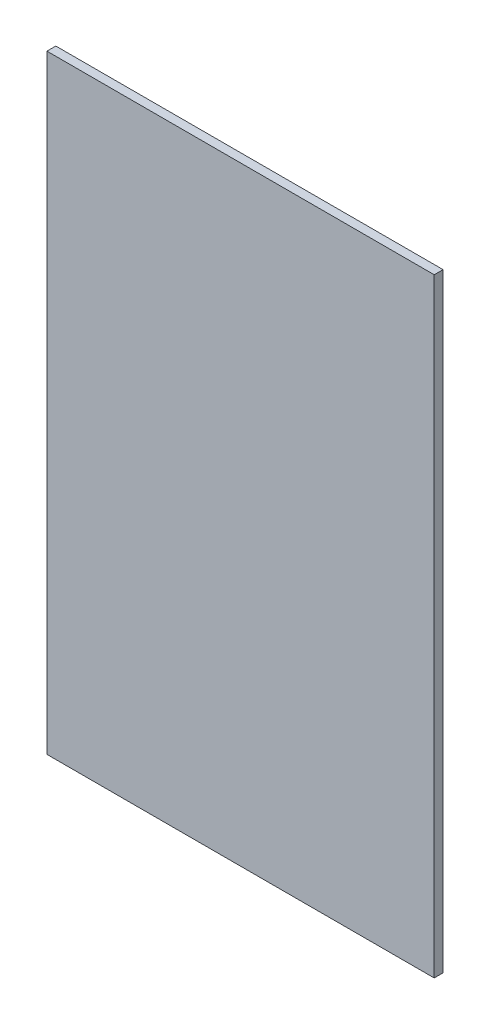
ISO-10303-21;
HEADER;
FILE_DESCRIPTION(('STEP AP214'),'2;1');
FILE_NAME('part.step','',(''),(''),'','','');
FILE_SCHEMA(('AUTOMOTIVE_DESIGN { 1 0 10303 214 1 1 1 1 }'));
ENDSEC;
DATA;
#1=APPLICATION_CONTEXT('core data for automotive mechanical design processes');
#2=APPLICATION_PROTOCOL_DEFINITION('international standard','automotive_design',2000,#1);
#3=PRODUCT_CONTEXT('',#1,'mechanical');
#4=PRODUCT('Part','Part','',(#3));
#5=PRODUCT_RELATED_PRODUCT_CATEGORY('part','',(#4));
#6=PRODUCT_DEFINITION_FORMATION('','',#4);
#7=PRODUCT_DEFINITION_CONTEXT('part definition',#1,'design');
#8=PRODUCT_DEFINITION('design','',#6,#7);
#9=PRODUCT_DEFINITION_SHAPE('','',#8);
#10=(LENGTH_UNIT() NAMED_UNIT(*) SI_UNIT(.MILLI.,.METRE.));
#11=(NAMED_UNIT(*) PLANE_ANGLE_UNIT() SI_UNIT($,.RADIAN.));
#12=(NAMED_UNIT(*) SI_UNIT($,.STERADIAN.) SOLID_ANGLE_UNIT());
#13=UNCERTAINTY_MEASURE_WITH_UNIT(LENGTH_MEASURE(1.E-05),#10,'distance_accuracy_value','');
#14=(GEOMETRIC_REPRESENTATION_CONTEXT(3) GLOBAL_UNCERTAINTY_ASSIGNED_CONTEXT((#13)) GLOBAL_UNIT_ASSIGNED_CONTEXT((#10,
#11,#12)) REPRESENTATION_CONTEXT('',''));
#15=CARTESIAN_POINT('',(0.,0.,0.));
#16=DIRECTION('',(0.,0.,1.));
#17=DIRECTION('',(1.,0.,0.));
#18=AXIS2_PLACEMENT_3D('',#15,#16,#17);
#19=CARTESIAN_POINT('',(65.5,-103.,3.));
#20=DIRECTION('',(-1.,0.,0.));
#21=DIRECTION('',(0.,0.,1.));
#22=AXIS2_PLACEMENT_3D('',#19,#20,#21);
#23=PLANE('',#22);
#24=DIRECTION('',(0.,1.,0.));
#25=VECTOR('',#24,1.);
#26=CARTESIAN_POINT('',(65.5,-103.,0.));
#27=LINE('',#26,#25);
#28=CARTESIAN_POINT('',(65.5,-103.,0.));
#29=VERTEX_POINT('',#28);
#30=CARTESIAN_POINT('',(65.5,103.,0.));
#31=VERTEX_POINT('',#30);
#32=EDGE_CURVE('E128',#29,#31,#27,.T.);
#33=ORIENTED_EDGE('',*,*,#32,.T.);
#34=DIRECTION('',(0.,0.,-1.));
#35=VECTOR('',#34,1.);
#36=CARTESIAN_POINT('',(65.5,103.,3.));
#37=LINE('',#36,#35);
#38=CARTESIAN_POINT('',(65.5,103.,3.));
#39=VERTEX_POINT('',#38);
#40=EDGE_CURVE('E12',#39,#31,#37,.T.);
#41=ORIENTED_EDGE('',*,*,#40,.F.);
#42=DIRECTION('',(0.,1.,0.));
#43=VECTOR('',#42,1.);
#44=CARTESIAN_POINT('',(65.5,-103.,3.));
#45=LINE('',#44,#43);
#46=CARTESIAN_POINT('',(65.5,-103.,3.));
#47=VERTEX_POINT('',#46);
#48=EDGE_CURVE('E92',#47,#39,#45,.T.);
#49=ORIENTED_EDGE('',*,*,#48,.F.);
#50=DIRECTION('',(0.,0.,-1.));
#51=VECTOR('',#50,1.);
#52=CARTESIAN_POINT('',(65.5,-103.,3.));
#53=LINE('',#52,#51);
#54=EDGE_CURVE('E104',#47,#29,#53,.T.);
#55=ORIENTED_EDGE('',*,*,#54,.T.);
#56=EDGE_LOOP('',(#33,#41,#49,#55));
#57=FACE_BOUND('',#56,.T.);
#58=ADVANCED_FACE('F40',(#57),#23,.F.);
#59=CARTESIAN_POINT('',(-65.5,103.,3.));
#60=DIRECTION('',(0.,-1.,0.));
#61=DIRECTION('',(0.,0.,-1.));
#62=AXIS2_PLACEMENT_3D('',#59,#60,#61);
#63=PLANE('',#62);
#64=DIRECTION('',(-1.,0.,0.));
#65=VECTOR('',#64,1.);
#66=CARTESIAN_POINT('',(-65.5,103.,0.));
#67=LINE('',#66,#65);
#68=CARTESIAN_POINT('',(-65.5,103.,0.));
#69=VERTEX_POINT('',#68);
#70=EDGE_CURVE('E97',#31,#69,#67,.T.);
#71=ORIENTED_EDGE('',*,*,#70,.T.);
#72=DIRECTION('',(0.,0.,-1.));
#73=VECTOR('',#72,1.);
#74=CARTESIAN_POINT('',(-65.5,103.,3.));
#75=LINE('',#74,#73);
#76=CARTESIAN_POINT('',(-65.5,103.,3.));
#77=VERTEX_POINT('',#76);
#78=EDGE_CURVE('E49',#77,#69,#75,.T.);
#79=ORIENTED_EDGE('',*,*,#78,.F.);
#80=DIRECTION('',(-1.,0.,0.));
#81=VECTOR('',#80,1.);
#82=CARTESIAN_POINT('',(-65.5,103.,3.));
#83=LINE('',#82,#81);
#84=EDGE_CURVE('E87',#39,#77,#83,.T.);
#85=ORIENTED_EDGE('',*,*,#84,.F.);
#86=ORIENTED_EDGE('',*,*,#40,.T.);
#87=EDGE_LOOP('',(#71,#79,#85,#86));
#88=FACE_BOUND('',#87,.T.);
#89=ADVANCED_FACE('F96',(#88),#63,.F.);
#90=CARTESIAN_POINT('',(-65.5,-103.,3.));
#91=DIRECTION('',(1.,0.,0.));
#92=DIRECTION('',(0.,0.,-1.));
#93=AXIS2_PLACEMENT_3D('',#90,#91,#92);
#94=PLANE('',#93);
#95=DIRECTION('',(0.,-1.,0.));
#96=VECTOR('',#95,1.);
#97=CARTESIAN_POINT('',(-65.5,-103.,0.));
#98=LINE('',#97,#96);
#99=CARTESIAN_POINT('',(-65.5,-103.,0.));
#100=VERTEX_POINT('',#99);
#101=EDGE_CURVE('E74',#69,#100,#98,.T.);
#102=ORIENTED_EDGE('',*,*,#101,.T.);
#103=DIRECTION('',(0.,0.,-1.));
#104=VECTOR('',#103,1.);
#105=CARTESIAN_POINT('',(-65.5,-103.,3.));
#106=LINE('',#105,#104);
#107=CARTESIAN_POINT('',(-65.5,-103.,3.));
#108=VERTEX_POINT('',#107);
#109=EDGE_CURVE('E99',#108,#100,#106,.T.);
#110=ORIENTED_EDGE('',*,*,#109,.F.);
#111=DIRECTION('',(0.,-1.,0.));
#112=VECTOR('',#111,1.);
#113=CARTESIAN_POINT('',(-65.5,-103.,3.));
#114=LINE('',#113,#112);
#115=EDGE_CURVE('E90',#77,#108,#114,.T.);
#116=ORIENTED_EDGE('',*,*,#115,.F.);
#117=ORIENTED_EDGE('',*,*,#78,.T.);
#118=EDGE_LOOP('',(#102,#110,#116,#117));
#119=FACE_BOUND('',#118,.T.);
#120=ADVANCED_FACE('F100',(#119),#94,.F.);
#121=CARTESIAN_POINT('',(-65.5,-103.,3.));
#122=DIRECTION('',(0.,1.,0.));
#123=DIRECTION('',(0.,0.,1.));
#124=AXIS2_PLACEMENT_3D('',#121,#122,#123);
#125=PLANE('',#124);
#126=DIRECTION('',(1.,0.,0.));
#127=VECTOR('',#126,1.);
#128=CARTESIAN_POINT('',(-65.5,-103.,0.));
#129=LINE('',#128,#127);
#130=EDGE_CURVE('E80',#100,#29,#129,.T.);
#131=ORIENTED_EDGE('',*,*,#130,.T.);
#132=ORIENTED_EDGE('',*,*,#54,.F.);
#133=DIRECTION('',(1.,0.,0.));
#134=VECTOR('',#133,1.);
#135=CARTESIAN_POINT('',(-65.5,-103.,3.));
#136=LINE('',#135,#134);
#137=EDGE_CURVE('E57',#108,#47,#136,.T.);
#138=ORIENTED_EDGE('',*,*,#137,.F.);
#139=ORIENTED_EDGE('',*,*,#109,.T.);
#140=EDGE_LOOP('',(#131,#132,#138,#139));
#141=FACE_BOUND('',#140,.T.);
#142=ADVANCED_FACE('F123',(#141),#125,.F.);
#143=CARTESIAN_POINT('',(0.,0.,3.));
#144=DIRECTION('',(0.,0.,-1.));
#145=DIRECTION('',(-1.,0.,0.));
#146=AXIS2_PLACEMENT_3D('',#143,#144,#145);
#147=PLANE('',#146);
#148=ORIENTED_EDGE('',*,*,#48,.T.);
#149=ORIENTED_EDGE('',*,*,#84,.T.);
#150=ORIENTED_EDGE('',*,*,#115,.T.);
#151=ORIENTED_EDGE('',*,*,#137,.T.);
#152=EDGE_LOOP('',(#148,#149,#150,#151));
#153=FACE_BOUND('',#152,.T.);
#154=ADVANCED_FACE('F88',(#153),#147,.F.);
#155=CARTESIAN_POINT('',(0.,0.,0.));
#156=DIRECTION('',(0.,0.,-1.));
#157=DIRECTION('',(-1.,0.,0.));
#158=AXIS2_PLACEMENT_3D('',#155,#156,#157);
#159=PLANE('',#158);
#160=ORIENTED_EDGE('',*,*,#32,.F.);
#161=ORIENTED_EDGE('',*,*,#130,.F.);
#162=ORIENTED_EDGE('',*,*,#101,.F.);
#163=ORIENTED_EDGE('',*,*,#70,.F.);
#164=EDGE_LOOP('',(#160,#161,#162,#163));
#165=FACE_BOUND('',#164,.T.);
#166=ADVANCED_FACE('F126',(#165),#159,.T.);
#167=CLOSED_SHELL('',(#58,#89,#120,#142,#154,#166));
#168=MANIFOLD_SOLID_BREP('B2',#167);
#169=ADVANCED_BREP_SHAPE_REPRESENTATION('',(#18,#168),#14);
#170=SHAPE_DEFINITION_REPRESENTATION(#9,#169);
ENDSEC;
END-ISO-10303-21;
